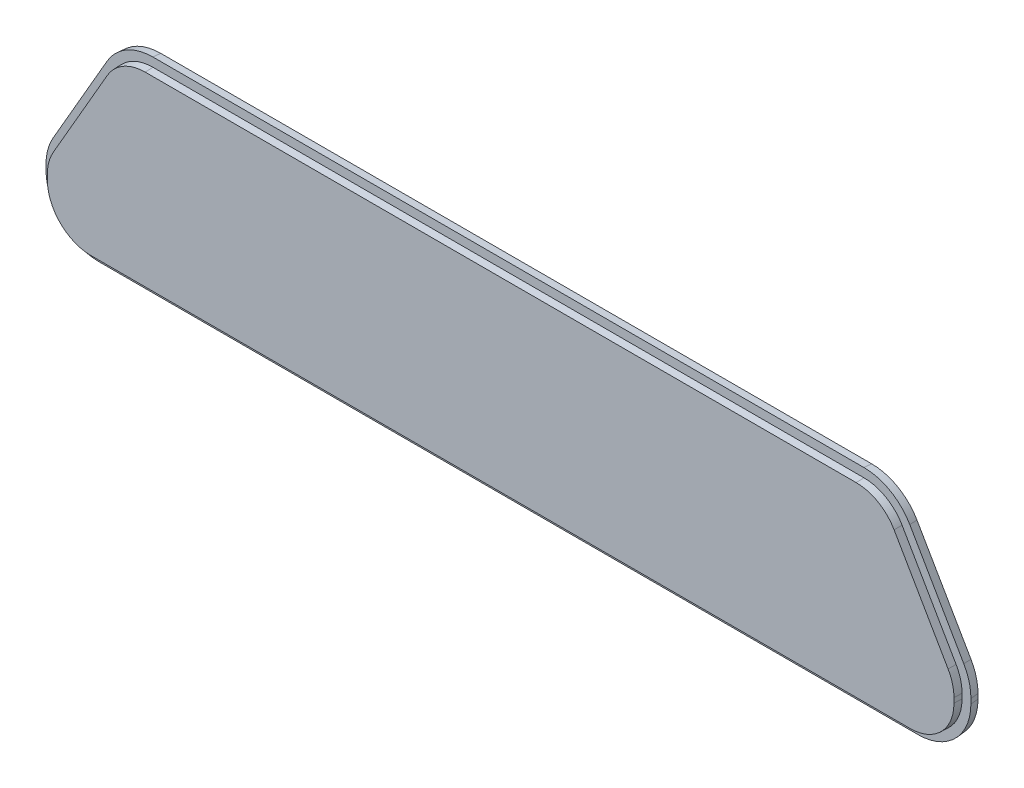
ISO-10303-21;
HEADER;
FILE_DESCRIPTION(('STEP AP214'),'2;1');
FILE_NAME('part.step','',(''),(''),'','','');
FILE_SCHEMA(('AUTOMOTIVE_DESIGN { 1 0 10303 214 1 1 1 1 }'));
ENDSEC;
DATA;
#1=APPLICATION_CONTEXT('core data for automotive mechanical design processes');
#2=APPLICATION_PROTOCOL_DEFINITION('international standard','automotive_design',2000,#1);
#3=PRODUCT_CONTEXT('',#1,'mechanical');
#4=PRODUCT('Part','Part','',(#3));
#5=PRODUCT_RELATED_PRODUCT_CATEGORY('part','',(#4));
#6=PRODUCT_DEFINITION_FORMATION('','',#4);
#7=PRODUCT_DEFINITION_CONTEXT('part definition',#1,'design');
#8=PRODUCT_DEFINITION('design','',#6,#7);
#9=PRODUCT_DEFINITION_SHAPE('','',#8);
#10=(LENGTH_UNIT() NAMED_UNIT(*) SI_UNIT(.MILLI.,.METRE.));
#11=(NAMED_UNIT(*) PLANE_ANGLE_UNIT() SI_UNIT($,.RADIAN.));
#12=(NAMED_UNIT(*) SI_UNIT($,.STERADIAN.) SOLID_ANGLE_UNIT());
#13=UNCERTAINTY_MEASURE_WITH_UNIT(LENGTH_MEASURE(1.E-05),#10,'distance_accuracy_value','');
#14=(GEOMETRIC_REPRESENTATION_CONTEXT(3) GLOBAL_UNCERTAINTY_ASSIGNED_CONTEXT((#13)) GLOBAL_UNIT_ASSIGNED_CONTEXT((#10,
#11,#12)) REPRESENTATION_CONTEXT('',''));
#15=CARTESIAN_POINT('',(0.,0.,0.));
#16=DIRECTION('',(0.,0.,1.));
#17=DIRECTION('',(1.,0.,0.));
#18=AXIS2_PLACEMENT_3D('',#15,#16,#17);
#19=CARTESIAN_POINT('',(-57.992183374922,24.6888,1.27));
#20=DIRECTION('',(0.,0.,1.));
#21=DIRECTION('',(1.,0.,0.));
#22=AXIS2_PLACEMENT_3D('',#19,#20,#21);
#23=PLANE('',#22);
#24=CARTESIAN_POINT('',(-57.992183374922,24.6888,1.27));
#25=DIRECTION('',(0.,0.,1.));
#26=DIRECTION('',(1.,0.,0.));
#27=AXIS2_PLACEMENT_3D('',#24,#25,#26);
#28=CIRCLE('',#27,7.14385062274547);
#29=CARTESIAN_POINT('',(-57.992183374922,31.8326506227455,1.27));
#30=VERTEX_POINT('',#29);
#31=CARTESIAN_POINT('',(-64.1789394950609,28.2607253113728,1.27));
#32=VERTEX_POINT('',#31);
#33=EDGE_CURVE('E267',#30,#32,#28,.T.);
#34=ORIENTED_EDGE('',*,*,#33,.T.);
#35=DIRECTION('',(-0.5,-0.866025403784438,0.));
#36=VECTOR('',#35,1.);
#37=CARTESIAN_POINT('',(-64.1789394950609,28.2607253113728,1.27));
#38=LINE('',#37,#36);
#39=CARTESIAN_POINT('',(-72.9887561201389,13.0016753113727,1.27));
#40=VERTEX_POINT('',#39);
#41=EDGE_CURVE('E257',#32,#40,#38,.T.);
#42=ORIENTED_EDGE('',*,*,#41,.T.);
#43=CARTESIAN_POINT('',(-66.802,9.42975,1.27));
#44=DIRECTION('',(0.,0.,1.));
#45=DIRECTION('',(1.,0.,0.));
#46=AXIS2_PLACEMENT_3D('',#43,#44,#45);
#47=CIRCLE('',#46,7.14385062274547);
#48=CARTESIAN_POINT('',(-73.9458506227455,9.42975,1.27));
#49=VERTEX_POINT('',#48);
#50=EDGE_CURVE('E251',#40,#49,#47,.T.);
#51=ORIENTED_EDGE('',*,*,#50,.T.);
#52=DIRECTION('',(0.,-1.,0.));
#53=VECTOR('',#52,1.);
#54=CARTESIAN_POINT('',(-73.9458506227455,9.42975,1.27));
#55=LINE('',#54,#53);
#56=CARTESIAN_POINT('',(-73.9458506227455,8.636,1.27));
#57=VERTEX_POINT('',#56);
#58=EDGE_CURVE('E250',#49,#57,#55,.T.);
#59=ORIENTED_EDGE('',*,*,#58,.T.);
#60=CARTESIAN_POINT('',(-66.802,8.636,1.27));
#61=DIRECTION('',(0.,0.,1.));
#62=DIRECTION('',(1.,0.,0.));
#63=AXIS2_PLACEMENT_3D('',#60,#61,#62);
#64=CIRCLE('',#63,7.14385062274549);
#65=CARTESIAN_POINT('',(-66.802,1.49214937725451,1.27));
#66=VERTEX_POINT('',#65);
#67=EDGE_CURVE('E242',#57,#66,#64,.T.);
#68=ORIENTED_EDGE('',*,*,#67,.T.);
#69=DIRECTION('',(1.,0.,0.));
#70=VECTOR('',#69,1.);
#71=CARTESIAN_POINT('',(-66.802,1.49214937725451,1.27));
#72=LINE('',#71,#70);
#73=CARTESIAN_POINT('',(66.802,1.49214937725452,1.27));
#74=VERTEX_POINT('',#73);
#75=EDGE_CURVE('E300',#66,#74,#72,.T.);
#76=ORIENTED_EDGE('',*,*,#75,.T.);
#77=CARTESIAN_POINT('',(66.802,8.636,1.27));
#78=DIRECTION('',(0.,0.,1.));
#79=DIRECTION('',(1.,0.,0.));
#80=AXIS2_PLACEMENT_3D('',#77,#78,#79);
#81=CIRCLE('',#80,7.14385062274549);
#82=CARTESIAN_POINT('',(73.9458506227455,8.636,1.27));
#83=VERTEX_POINT('',#82);
#84=EDGE_CURVE('E241',#74,#83,#81,.T.);
#85=ORIENTED_EDGE('',*,*,#84,.T.);
#86=DIRECTION('',(0.,1.,0.));
#87=VECTOR('',#86,1.);
#88=CARTESIAN_POINT('',(73.9458506227455,8.636,1.27));
#89=LINE('',#88,#87);
#90=CARTESIAN_POINT('',(73.9458506227455,9.42975,1.27));
#91=VERTEX_POINT('',#90);
#92=EDGE_CURVE('E221',#83,#91,#89,.T.);
#93=ORIENTED_EDGE('',*,*,#92,.T.);
#94=CARTESIAN_POINT('',(66.802,9.42975,1.27));
#95=DIRECTION('',(0.,0.,1.));
#96=DIRECTION('',(1.,0.,0.));
#97=AXIS2_PLACEMENT_3D('',#94,#95,#96);
#98=CIRCLE('',#97,7.14385062274549);
#99=CARTESIAN_POINT('',(72.9887561201389,13.0016753113728,1.27));
#100=VERTEX_POINT('',#99);
#101=EDGE_CURVE('E218',#91,#100,#98,.T.);
#102=ORIENTED_EDGE('',*,*,#101,.T.);
#103=DIRECTION('',(-0.5,0.866025403784438,0.));
#104=VECTOR('',#103,1.);
#105=CARTESIAN_POINT('',(72.9887561201389,13.0016753113728,1.27));
#106=LINE('',#105,#104);
#107=CARTESIAN_POINT('',(64.1789394950609,28.2607253113728,1.27));
#108=VERTEX_POINT('',#107);
#109=EDGE_CURVE('E206',#100,#108,#106,.T.);
#110=ORIENTED_EDGE('',*,*,#109,.T.);
#111=CARTESIAN_POINT('',(57.992183374922,24.6888,1.27));
#112=DIRECTION('',(0.,0.,1.));
#113=DIRECTION('',(1.,0.,0.));
#114=AXIS2_PLACEMENT_3D('',#111,#112,#113);
#115=CIRCLE('',#114,7.14385062274546);
#116=CARTESIAN_POINT('',(57.992183374922,31.8326506227455,1.27));
#117=VERTEX_POINT('',#116);
#118=EDGE_CURVE('E26',#108,#117,#115,.T.);
#119=ORIENTED_EDGE('',*,*,#118,.T.);
#120=DIRECTION('',(-1.,0.,0.));
#121=VECTOR('',#120,1.);
#122=CARTESIAN_POINT('',(57.992183374922,31.8326506227455,1.27));
#123=LINE('',#122,#121);
#124=EDGE_CURVE('E11',#117,#30,#123,.T.);
#125=ORIENTED_EDGE('',*,*,#124,.T.);
#126=EDGE_LOOP('',(#34,#42,#51,#59,#68,#76,#85,#93,#102,#110,#119,#125));
#127=FACE_BOUND('',#126,.T.);
#128=ADVANCED_FACE('F17',(#127),#23,.T.);
#129=CARTESIAN_POINT('',(57.992183374922,31.877,0.));
#130=DIRECTION('',(0.,0.999390827019096,0.034899496702501));
#131=DIRECTION('',(1.,0.,0.));
#132=AXIS2_PLACEMENT_3D('',#129,#130,#131);
#133=PLANE('',#132);
#134=DIRECTION('',(-1.,0.,0.));
#135=VECTOR('',#134,1.);
#136=CARTESIAN_POINT('',(57.992183374922,31.877,0.));
#137=LINE('',#136,#135);
#138=CARTESIAN_POINT('',(57.992183374922,31.877,0.));
#139=VERTEX_POINT('',#138);
#140=CARTESIAN_POINT('',(-57.992183374922,31.877,0.));
#141=VERTEX_POINT('',#140);
#142=EDGE_CURVE('E382',#139,#141,#137,.T.);
#143=ORIENTED_EDGE('',*,*,#142,.T.);
#144=DIRECTION('',(0.,0.034899496702501,-0.999390827019096));
#145=VECTOR('',#144,1.);
#146=CARTESIAN_POINT('',(-57.992183374922,31.877,0.));
#147=LINE('',#146,#145);
#148=EDGE_CURVE('E264',#30,#141,#147,.T.);
#149=ORIENTED_EDGE('',*,*,#148,.F.);
#150=ORIENTED_EDGE('',*,*,#124,.F.);
#151=DIRECTION('',(0.,0.034899496702501,-0.999390827019096));
#152=VECTOR('',#151,1.);
#153=CARTESIAN_POINT('',(57.992183374922,31.877,0.));
#154=LINE('',#153,#152);
#155=EDGE_CURVE('E216',#117,#139,#154,.T.);
#156=ORIENTED_EDGE('',*,*,#155,.T.);
#157=EDGE_LOOP('',(#143,#149,#150,#156));
#158=FACE_BOUND('',#157,.T.);
#159=ADVANCED_FACE('F551',(#158),#133,.T.);
#160=CARTESIAN_POINT('',(57.992183374922,24.6888,0.));
#161=DIRECTION('',(0.,0.,-1.));
#162=DIRECTION('',(1.,0.,0.));
#163=AXIS2_PLACEMENT_3D('',#160,#161,#162);
#164=CONICAL_SURFACE('',#163,7.1882,0.0349065850398857);
#165=CARTESIAN_POINT('',(57.992183374922,24.6888,0.));
#166=DIRECTION('',(0.,0.,1.));
#167=DIRECTION('',(1.,0.,0.));
#168=AXIS2_PLACEMENT_3D('',#165,#166,#167);
#169=CIRCLE('',#168,7.1882);
#170=CARTESIAN_POINT('',(64.2173471824053,28.2829,0.));
#171=VERTEX_POINT('',#170);
#172=EDGE_CURVE('E386',#171,#139,#169,.T.);
#173=ORIENTED_EDGE('',*,*,#172,.T.);
#174=ORIENTED_EDGE('',*,*,#155,.F.);
#175=ORIENTED_EDGE('',*,*,#118,.F.);
#176=DIRECTION('',(0.0302238507236571,0.0174497483512506,-0.999390827019096));
#177=VECTOR('',#176,1.);
#178=CARTESIAN_POINT('',(64.2173471824053,28.2829,0.));
#179=LINE('',#178,#177);
#180=EDGE_CURVE('E213',#108,#171,#179,.T.);
#181=ORIENTED_EDGE('',*,*,#180,.T.);
#182=EDGE_LOOP('',(#173,#174,#175,#181));
#183=FACE_BOUND('',#182,.T.);
#184=ADVANCED_FACE('F558',(#183),#164,.T.);
#185=CARTESIAN_POINT('',(73.0271638074833,13.02385,0.));
#186=DIRECTION('',(0.865497844507675,0.49969541350955,0.034899496702501));
#187=DIRECTION('',(0.,0.0696718216761224,-0.997569966099787));
#188=AXIS2_PLACEMENT_3D('',#185,#186,#187);
#189=PLANE('',#188);
#190=DIRECTION('',(-0.5,0.866025403784438,0.));
#191=VECTOR('',#190,1.);
#192=CARTESIAN_POINT('',(73.0271638074833,13.02385,0.));
#193=LINE('',#192,#191);
#194=CARTESIAN_POINT('',(73.0271638074833,13.02385,0.));
#195=VERTEX_POINT('',#194);
#196=EDGE_CURVE('E379',#195,#171,#193,.T.);
#197=ORIENTED_EDGE('',*,*,#196,.T.);
#198=ORIENTED_EDGE('',*,*,#180,.F.);
#199=ORIENTED_EDGE('',*,*,#109,.F.);
#200=DIRECTION('',(0.0302238507236571,0.0174497483512506,-0.999390827019096));
#201=VECTOR('',#200,1.);
#202=CARTESIAN_POINT('',(73.0271638074833,13.02385,0.));
#203=LINE('',#202,#201);
#204=EDGE_CURVE('E211',#100,#195,#203,.T.);
#205=ORIENTED_EDGE('',*,*,#204,.T.);
#206=EDGE_LOOP('',(#197,#198,#199,#205));
#207=FACE_BOUND('',#206,.T.);
#208=ADVANCED_FACE('F209',(#207),#189,.T.);
#209=CARTESIAN_POINT('',(66.802,9.42975,0.));
#210=DIRECTION('',(0.,0.,-1.));
#211=DIRECTION('',(1.,0.,0.));
#212=AXIS2_PLACEMENT_3D('',#209,#210,#211);
#213=CONICAL_SURFACE('',#212,7.1882,0.0349065850398857);
#214=CARTESIAN_POINT('',(66.802,9.42975,0.));
#215=DIRECTION('',(0.,0.,1.));
#216=DIRECTION('',(1.,0.,0.));
#217=AXIS2_PLACEMENT_3D('',#214,#215,#216);
#218=CIRCLE('',#217,7.1882);
#219=CARTESIAN_POINT('',(73.9902,9.42975,0.));
#220=VERTEX_POINT('',#219);
#221=EDGE_CURVE('E228',#220,#195,#218,.T.);
#222=ORIENTED_EDGE('',*,*,#221,.T.);
#223=ORIENTED_EDGE('',*,*,#204,.F.);
#224=ORIENTED_EDGE('',*,*,#101,.F.);
#225=DIRECTION('',(0.034899496702501,0.,-0.999390827019096));
#226=VECTOR('',#225,1.);
#227=CARTESIAN_POINT('',(73.9902,9.42975,0.));
#228=LINE('',#227,#226);
#229=EDGE_CURVE('E236',#91,#220,#228,.T.);
#230=ORIENTED_EDGE('',*,*,#229,.T.);
#231=EDGE_LOOP('',(#222,#223,#224,#230));
#232=FACE_BOUND('',#231,.T.);
#233=ADVANCED_FACE('F226',(#232),#213,.T.);
#234=CARTESIAN_POINT('',(73.9902,8.636,0.));
#235=DIRECTION('',(0.999390827019096,0.,0.034899496702501));
#236=DIRECTION('',(0.,-1.,0.));
#237=AXIS2_PLACEMENT_3D('',#234,#235,#236);
#238=PLANE('',#237);
#239=DIRECTION('',(0.,1.,0.));
#240=VECTOR('',#239,1.);
#241=CARTESIAN_POINT('',(73.9902,8.636,0.));
#242=LINE('',#241,#240);
#243=CARTESIAN_POINT('',(73.9902,8.636,0.));
#244=VERTEX_POINT('',#243);
#245=EDGE_CURVE('E374',#244,#220,#242,.T.);
#246=ORIENTED_EDGE('',*,*,#245,.T.);
#247=ORIENTED_EDGE('',*,*,#229,.F.);
#248=ORIENTED_EDGE('',*,*,#92,.F.);
#249=DIRECTION('',(0.034899496702501,0.,-0.999390827019096));
#250=VECTOR('',#249,1.);
#251=CARTESIAN_POINT('',(73.9902,8.636,0.));
#252=LINE('',#251,#250);
#253=EDGE_CURVE('E270',#83,#244,#252,.T.);
#254=ORIENTED_EDGE('',*,*,#253,.T.);
#255=EDGE_LOOP('',(#246,#247,#248,#254));
#256=FACE_BOUND('',#255,.T.);
#257=ADVANCED_FACE('F580',(#256),#238,.T.);
#258=CARTESIAN_POINT('',(66.802,8.636,0.));
#259=DIRECTION('',(0.,0.,-1.));
#260=DIRECTION('',(1.,0.,0.));
#261=AXIS2_PLACEMENT_3D('',#258,#259,#260);
#262=CONICAL_SURFACE('',#261,7.1882,0.0349065850398857);
#263=CARTESIAN_POINT('',(66.802,8.636,0.));
#264=DIRECTION('',(0.,0.,1.));
#265=DIRECTION('',(1.,0.,0.));
#266=AXIS2_PLACEMENT_3D('',#263,#264,#265);
#267=CIRCLE('',#266,7.1882);
#268=CARTESIAN_POINT('',(66.802,1.4478,0.));
#269=VERTEX_POINT('',#268);
#270=EDGE_CURVE('E370',#269,#244,#267,.T.);
#271=ORIENTED_EDGE('',*,*,#270,.T.);
#272=ORIENTED_EDGE('',*,*,#253,.F.);
#273=ORIENTED_EDGE('',*,*,#84,.F.);
#274=DIRECTION('',(0.,-0.034899496702501,-0.999390827019096));
#275=VECTOR('',#274,1.);
#276=CARTESIAN_POINT('',(66.802,1.4478,0.));
#277=LINE('',#276,#275);
#278=EDGE_CURVE('E246',#74,#269,#277,.T.);
#279=ORIENTED_EDGE('',*,*,#278,.T.);
#280=EDGE_LOOP('',(#271,#272,#273,#279));
#281=FACE_BOUND('',#280,.T.);
#282=ADVANCED_FACE('F585',(#281),#262,.T.);
#283=CARTESIAN_POINT('',(-66.802,1.44779999999999,0.));
#284=DIRECTION('',(0.,-0.999390827019096,0.034899496702501));
#285=DIRECTION('',(-1.,0.,0.));
#286=AXIS2_PLACEMENT_3D('',#283,#284,#285);
#287=PLANE('',#286);
#288=DIRECTION('',(1.,0.,0.));
#289=VECTOR('',#288,1.);
#290=CARTESIAN_POINT('',(-66.802,1.44779999999999,0.));
#291=LINE('',#290,#289);
#292=CARTESIAN_POINT('',(-66.802,1.44779999999998,0.));
#293=VERTEX_POINT('',#292);
#294=EDGE_CURVE('E364',#293,#269,#291,.T.);
#295=ORIENTED_EDGE('',*,*,#294,.T.);
#296=ORIENTED_EDGE('',*,*,#278,.F.);
#297=ORIENTED_EDGE('',*,*,#75,.F.);
#298=DIRECTION('',(0.,-0.034899496702501,-0.999390827019096));
#299=VECTOR('',#298,1.);
#300=CARTESIAN_POINT('',(-66.802,1.44779999999999,0.));
#301=LINE('',#300,#299);
#302=EDGE_CURVE('E247',#66,#293,#301,.T.);
#303=ORIENTED_EDGE('',*,*,#302,.T.);
#304=EDGE_LOOP('',(#295,#296,#297,#303));
#305=FACE_BOUND('',#304,.T.);
#306=ADVANCED_FACE('F589',(#305),#287,.T.);
#307=CARTESIAN_POINT('',(-66.802,8.636,0.));
#308=DIRECTION('',(0.,0.,-1.));
#309=DIRECTION('',(1.,0.,0.));
#310=AXIS2_PLACEMENT_3D('',#307,#308,#309);
#311=CONICAL_SURFACE('',#310,7.1882,0.0349065850398857);
#312=CARTESIAN_POINT('',(-66.802,8.636,0.));
#313=DIRECTION('',(0.,0.,1.));
#314=DIRECTION('',(1.,0.,0.));
#315=AXIS2_PLACEMENT_3D('',#312,#313,#314);
#316=CIRCLE('',#315,7.1882);
#317=CARTESIAN_POINT('',(-73.9902,8.636,0.));
#318=VERTEX_POINT('',#317);
#319=EDGE_CURVE('E360',#318,#293,#316,.T.);
#320=ORIENTED_EDGE('',*,*,#319,.T.);
#321=ORIENTED_EDGE('',*,*,#302,.F.);
#322=ORIENTED_EDGE('',*,*,#67,.F.);
#323=DIRECTION('',(-0.034899496702501,0.,-0.999390827019096));
#324=VECTOR('',#323,1.);
#325=CARTESIAN_POINT('',(-73.9902,8.636,0.));
#326=LINE('',#325,#324);
#327=EDGE_CURVE('E255',#57,#318,#326,.T.);
#328=ORIENTED_EDGE('',*,*,#327,.T.);
#329=EDGE_LOOP('',(#320,#321,#322,#328));
#330=FACE_BOUND('',#329,.T.);
#331=ADVANCED_FACE('F598',(#330),#311,.T.);
#332=CARTESIAN_POINT('',(-73.9902,9.42975,0.));
#333=DIRECTION('',(-0.999390827019096,0.,0.034899496702501));
#334=DIRECTION('',(0.,1.,0.));
#335=AXIS2_PLACEMENT_3D('',#332,#333,#334);
#336=PLANE('',#335);
#337=DIRECTION('',(0.,-1.,0.));
#338=VECTOR('',#337,1.);
#339=CARTESIAN_POINT('',(-73.9902,9.42975,0.));
#340=LINE('',#339,#338);
#341=CARTESIAN_POINT('',(-73.9902,9.42975,0.));
#342=VERTEX_POINT('',#341);
#343=EDGE_CURVE('E356',#342,#318,#340,.T.);
#344=ORIENTED_EDGE('',*,*,#343,.T.);
#345=ORIENTED_EDGE('',*,*,#327,.F.);
#346=ORIENTED_EDGE('',*,*,#58,.F.);
#347=DIRECTION('',(-0.034899496702501,0.,-0.999390827019096));
#348=VECTOR('',#347,1.);
#349=CARTESIAN_POINT('',(-73.9902,9.42975,0.));
#350=LINE('',#349,#348);
#351=EDGE_CURVE('E256',#49,#342,#350,.T.);
#352=ORIENTED_EDGE('',*,*,#351,.T.);
#353=EDGE_LOOP('',(#344,#345,#346,#352));
#354=FACE_BOUND('',#353,.T.);
#355=ADVANCED_FACE('F607',(#354),#336,.T.);
#356=CARTESIAN_POINT('',(-66.802,9.42975,0.));
#357=DIRECTION('',(0.,0.,-1.));
#358=DIRECTION('',(1.,0.,0.));
#359=AXIS2_PLACEMENT_3D('',#356,#357,#358);
#360=CONICAL_SURFACE('',#359,7.1882,0.0349065850398857);
#361=CARTESIAN_POINT('',(-66.802,9.42975,0.));
#362=DIRECTION('',(0.,0.,1.));
#363=DIRECTION('',(1.,0.,0.));
#364=AXIS2_PLACEMENT_3D('',#361,#362,#363);
#365=CIRCLE('',#364,7.1882);
#366=CARTESIAN_POINT('',(-73.0271638074833,13.02385,0.));
#367=VERTEX_POINT('',#366);
#368=EDGE_CURVE('E348',#367,#342,#365,.T.);
#369=ORIENTED_EDGE('',*,*,#368,.T.);
#370=ORIENTED_EDGE('',*,*,#351,.F.);
#371=ORIENTED_EDGE('',*,*,#50,.F.);
#372=DIRECTION('',(-0.0302238507236571,0.0174497483512506,-0.999390827019096));
#373=VECTOR('',#372,1.);
#374=CARTESIAN_POINT('',(-73.0271638074833,13.02385,0.));
#375=LINE('',#374,#373);
#376=EDGE_CURVE('E261',#40,#367,#375,.T.);
#377=ORIENTED_EDGE('',*,*,#376,.T.);
#378=EDGE_LOOP('',(#369,#370,#371,#377));
#379=FACE_BOUND('',#378,.T.);
#380=ADVANCED_FACE('F613',(#379),#360,.T.);
#381=CARTESIAN_POINT('',(-64.2173471824053,28.2829,0.));
#382=DIRECTION('',(-0.865497844507676,0.499695413509549,0.034899496702501));
#383=DIRECTION('',(0.0402902897014407,0.,0.999188016619382));
#384=AXIS2_PLACEMENT_3D('',#381,#382,#383);
#385=PLANE('',#384);
#386=DIRECTION('',(-0.5,-0.866025403784438,0.));
#387=VECTOR('',#386,1.);
#388=CARTESIAN_POINT('',(-64.2173471824053,28.2829,0.));
#389=LINE('',#388,#387);
#390=CARTESIAN_POINT('',(-64.2173471824053,28.2829,0.));
#391=VERTEX_POINT('',#390);
#392=EDGE_CURVE('E344',#391,#367,#389,.T.);
#393=ORIENTED_EDGE('',*,*,#392,.T.);
#394=ORIENTED_EDGE('',*,*,#376,.F.);
#395=ORIENTED_EDGE('',*,*,#41,.F.);
#396=DIRECTION('',(-0.0302238507236571,0.0174497483512505,-0.999390827019096));
#397=VECTOR('',#396,1.);
#398=CARTESIAN_POINT('',(-64.2173471824053,28.2829,0.));
#399=LINE('',#398,#397);
#400=EDGE_CURVE('E273',#32,#391,#399,.T.);
#401=ORIENTED_EDGE('',*,*,#400,.T.);
#402=EDGE_LOOP('',(#393,#394,#395,#401));
#403=FACE_BOUND('',#402,.T.);
#404=ADVANCED_FACE('F617',(#403),#385,.T.);
#405=CARTESIAN_POINT('',(-57.992183374922,24.6888,0.));
#406=DIRECTION('',(0.,0.,-1.));
#407=DIRECTION('',(1.,0.,0.));
#408=AXIS2_PLACEMENT_3D('',#405,#406,#407);
#409=CONICAL_SURFACE('',#408,7.1882,0.0349065850398857);
#410=CARTESIAN_POINT('',(-57.992183374922,24.6888,0.));
#411=DIRECTION('',(0.,0.,1.));
#412=DIRECTION('',(1.,0.,0.));
#413=AXIS2_PLACEMENT_3D('',#410,#411,#412);
#414=CIRCLE('',#413,7.1882);
#415=EDGE_CURVE('E387',#141,#391,#414,.T.);
#416=ORIENTED_EDGE('',*,*,#415,.T.);
#417=ORIENTED_EDGE('',*,*,#400,.F.);
#418=ORIENTED_EDGE('',*,*,#33,.F.);
#419=ORIENTED_EDGE('',*,*,#148,.T.);
#420=EDGE_LOOP('',(#416,#417,#418,#419));
#421=FACE_BOUND('',#420,.T.);
#422=ADVANCED_FACE('F634',(#421),#409,.T.);
#423=CARTESIAN_POINT('',(-57.992183374922,24.6888,-1.27));
#424=DIRECTION('',(0.,0.,-1.));
#425=DIRECTION('',(0.,-1.,0.));
#426=AXIS2_PLACEMENT_3D('',#423,#424,#425);
#427=PLANE('',#426);
#428=CARTESIAN_POINT('',(-57.992183374922,24.6888,-1.27));
#429=DIRECTION('',(0.,0.,1.));
#430=DIRECTION('',(-1.,0.,0.));
#431=AXIS2_PLACEMENT_3D('',#428,#429,#430);
#432=CIRCLE('',#431,8.52488939732207);
#433=CARTESIAN_POINT('',(-57.992183374922,33.2136893973221,-1.27));
#434=VERTEX_POINT('',#433);
#435=CARTESIAN_POINT('',(-65.3749541574555,28.951244698661,-1.27));
#436=VERTEX_POINT('',#435);
#437=EDGE_CURVE('E330',#434,#436,#432,.T.);
#438=ORIENTED_EDGE('',*,*,#437,.F.);
#439=DIRECTION('',(-1.,0.,0.));
#440=VECTOR('',#439,1.);
#441=CARTESIAN_POINT('',(57.992183374922,33.2136893973221,-1.27));
#442=LINE('',#441,#440);
#443=CARTESIAN_POINT('',(57.992183374922,33.2136893973221,-1.27));
#444=VERTEX_POINT('',#443);
#445=EDGE_CURVE('E322',#444,#434,#442,.T.);
#446=ORIENTED_EDGE('',*,*,#445,.F.);
#447=CARTESIAN_POINT('',(57.992183374922,24.6888,-1.27));
#448=DIRECTION('',(0.,0.,1.));
#449=DIRECTION('',(-1.,0.,0.));
#450=AXIS2_PLACEMENT_3D('',#447,#448,#449);
#451=CIRCLE('',#450,8.52488939732207);
#452=CARTESIAN_POINT('',(65.3749541574555,28.951244698661,-1.27));
#453=VERTEX_POINT('',#452);
#454=EDGE_CURVE('E316',#453,#444,#451,.T.);
#455=ORIENTED_EDGE('',*,*,#454,.F.);
#456=DIRECTION('',(-0.5,0.866025403784438,0.));
#457=VECTOR('',#456,1.);
#458=CARTESIAN_POINT('',(74.1847707825335,13.6921946986611,-1.27));
#459=LINE('',#458,#457);
#460=CARTESIAN_POINT('',(74.1847707825335,13.6921946986611,-1.27));
#461=VERTEX_POINT('',#460);
#462=EDGE_CURVE('E315',#461,#453,#459,.T.);
#463=ORIENTED_EDGE('',*,*,#462,.F.);
#464=CARTESIAN_POINT('',(66.802,9.42975,-1.27));
#465=DIRECTION('',(0.,0.,1.));
#466=DIRECTION('',(-1.,0.,0.));
#467=AXIS2_PLACEMENT_3D('',#464,#465,#466);
#468=CIRCLE('',#467,8.52488939732208);
#469=CARTESIAN_POINT('',(75.3268893973221,9.42975,-1.27));
#470=VERTEX_POINT('',#469);
#471=EDGE_CURVE('E307',#470,#461,#468,.T.);
#472=ORIENTED_EDGE('',*,*,#471,.F.);
#473=DIRECTION('',(0.,1.,0.));
#474=VECTOR('',#473,1.);
#475=CARTESIAN_POINT('',(75.3268893973221,9.42975,-1.27));
#476=LINE('',#475,#474);
#477=CARTESIAN_POINT('',(75.3268893973221,8.636,-1.27));
#478=VERTEX_POINT('',#477);
#479=EDGE_CURVE('E299',#478,#470,#476,.T.);
#480=ORIENTED_EDGE('',*,*,#479,.F.);
#481=CARTESIAN_POINT('',(66.802,8.636,-1.27));
#482=DIRECTION('',(0.,0.,1.));
#483=DIRECTION('',(-1.,0.,0.));
#484=AXIS2_PLACEMENT_3D('',#481,#482,#483);
#485=CIRCLE('',#484,8.52488939732208);
#486=CARTESIAN_POINT('',(66.802,0.111110602677924,-1.27));
#487=VERTEX_POINT('',#486);
#488=EDGE_CURVE('E293',#487,#478,#485,.T.);
#489=ORIENTED_EDGE('',*,*,#488,.F.);
#490=DIRECTION('',(1.,0.,0.));
#491=VECTOR('',#490,1.);
#492=CARTESIAN_POINT('',(-66.802,0.111110602677924,-1.27));
#493=LINE('',#492,#491);
#494=CARTESIAN_POINT('',(-66.802,0.111110602677915,-1.27));
#495=VERTEX_POINT('',#494);
#496=EDGE_CURVE('E281',#495,#487,#493,.T.);
#497=ORIENTED_EDGE('',*,*,#496,.F.);
#498=CARTESIAN_POINT('',(-66.802,8.636,-1.27));
#499=DIRECTION('',(0.,0.,1.));
#500=DIRECTION('',(-1.,0.,0.));
#501=AXIS2_PLACEMENT_3D('',#498,#499,#500);
#502=CIRCLE('',#501,8.52488939732209);
#503=CARTESIAN_POINT('',(-75.3268893973221,8.636,-1.27));
#504=VERTEX_POINT('',#503);
#505=EDGE_CURVE('E286',#504,#495,#502,.T.);
#506=ORIENTED_EDGE('',*,*,#505,.F.);
#507=DIRECTION('',(0.,-1.,0.));
#508=VECTOR('',#507,1.);
#509=CARTESIAN_POINT('',(-75.3268893973221,9.42975,-1.27));
#510=LINE('',#509,#508);
#511=CARTESIAN_POINT('',(-75.3268893973221,9.42975,-1.27));
#512=VERTEX_POINT('',#511);
#513=EDGE_CURVE('E334',#512,#504,#510,.T.);
#514=ORIENTED_EDGE('',*,*,#513,.F.);
#515=CARTESIAN_POINT('',(-66.802,9.42975,-1.27));
#516=DIRECTION('',(0.,0.,1.));
#517=DIRECTION('',(-1.,0.,0.));
#518=AXIS2_PLACEMENT_3D('',#515,#516,#517);
#519=CIRCLE('',#518,8.52488939732209);
#520=CARTESIAN_POINT('',(-74.1847707825335,13.692194698661,-1.27));
#521=VERTEX_POINT('',#520);
#522=EDGE_CURVE('E277',#521,#512,#519,.T.);
#523=ORIENTED_EDGE('',*,*,#522,.F.);
#524=DIRECTION('',(-0.5,-0.866025403784438,0.));
#525=VECTOR('',#524,1.);
#526=CARTESIAN_POINT('',(-65.3749541574555,28.951244698661,-1.27));
#527=LINE('',#526,#525);
#528=EDGE_CURVE('E274',#436,#521,#527,.T.);
#529=ORIENTED_EDGE('',*,*,#528,.F.);
#530=EDGE_LOOP('',(#438,#446,#455,#463,#472,#480,#489,#497,#506,#514,#523,#529));
#531=FACE_BOUND('',#530,.T.);
#532=ADVANCED_FACE('F519',(#531),#427,.T.);
#533=CARTESIAN_POINT('',(-65.4711787620044,29.0068,0.));
#534=DIRECTION('',(-0.86272991566282,0.498097349045875,-0.0871557427476584));
#535=DIRECTION('',(-0.100511613750393,0.,0.994935885120892));
#536=AXIS2_PLACEMENT_3D('',#533,#534,#535);
#537=PLANE('',#536);
#538=DIRECTION('',(-0.5,-0.866025403784438,0.));
#539=VECTOR('',#538,1.);
#540=CARTESIAN_POINT('',(-65.4711787620044,29.0068,0.));
#541=LINE('',#540,#539);
#542=CARTESIAN_POINT('',(-65.4711787620044,29.0068,0.));
#543=VERTEX_POINT('',#542);
#544=CARTESIAN_POINT('',(-74.2809953870824,13.74775,0.));
#545=VERTEX_POINT('',#544);
#546=EDGE_CURVE('E450',#543,#545,#541,.T.);
#547=ORIENTED_EDGE('',*,*,#546,.F.);
#548=DIRECTION('',(-0.0754790873051734,0.0435778713738294,0.996194698091746));
#549=VECTOR('',#548,1.);
#550=CARTESIAN_POINT('',(-65.4711787620044,29.0068,0.));
#551=LINE('',#550,#549);
#552=EDGE_CURVE('E326',#436,#543,#551,.T.);
#553=ORIENTED_EDGE('',*,*,#552,.F.);
#554=ORIENTED_EDGE('',*,*,#528,.T.);
#555=DIRECTION('',(-0.0754790873051734,0.0435778713738294,0.996194698091746));
#556=VECTOR('',#555,1.);
#557=CARTESIAN_POINT('',(-74.2809953870824,13.74775,0.));
#558=LINE('',#557,#556);
#559=EDGE_CURVE('E280',#521,#545,#558,.T.);
#560=ORIENTED_EDGE('',*,*,#559,.T.);
#561=EDGE_LOOP('',(#547,#553,#554,#560));
#562=FACE_BOUND('',#561,.T.);
#563=ADVANCED_FACE('F643',(#562),#537,.T.);
#564=CARTESIAN_POINT('',(-66.802,9.42975,0.));
#565=DIRECTION('',(0.,0.,1.));
#566=DIRECTION('',(1.,0.,0.));
#567=AXIS2_PLACEMENT_3D('',#564,#565,#566);
#568=CONICAL_SURFACE('',#567,8.636,0.0872664625997163);
#569=CARTESIAN_POINT('',(-66.802,9.42975,0.));
#570=DIRECTION('',(0.,0.,1.));
#571=DIRECTION('',(1.,0.,0.));
#572=AXIS2_PLACEMENT_3D('',#569,#570,#571);
#573=CIRCLE('',#572,8.636);
#574=CARTESIAN_POINT('',(-75.438,9.42975,0.));
#575=VERTEX_POINT('',#574);
#576=EDGE_CURVE('E441',#545,#575,#573,.T.);
#577=ORIENTED_EDGE('',*,*,#576,.F.);
#578=ORIENTED_EDGE('',*,*,#559,.F.);
#579=ORIENTED_EDGE('',*,*,#522,.T.);
#580=DIRECTION('',(-0.0871557427476584,0.,0.996194698091746));
#581=VECTOR('',#580,1.);
#582=CARTESIAN_POINT('',(-75.438,9.42975,0.));
#583=LINE('',#582,#581);
#584=EDGE_CURVE('E289',#512,#575,#583,.T.);
#585=ORIENTED_EDGE('',*,*,#584,.T.);
#586=EDGE_LOOP('',(#577,#578,#579,#585));
#587=FACE_BOUND('',#586,.T.);
#588=ADVANCED_FACE('F648',(#587),#568,.T.);
#589=CARTESIAN_POINT('',(-75.438,9.42975,0.));
#590=DIRECTION('',(-0.996194698091746,0.,-0.0871557427476584));
#591=DIRECTION('',(-0.0871557427476584,0.,0.996194698091746));
#592=AXIS2_PLACEMENT_3D('',#589,#590,#591);
#593=PLANE('',#592);
#594=DIRECTION('',(0.,-1.,0.));
#595=VECTOR('',#594,1.);
#596=CARTESIAN_POINT('',(-75.438,9.42975,0.));
#597=LINE('',#596,#595);
#598=CARTESIAN_POINT('',(-75.438,8.636,0.));
#599=VERTEX_POINT('',#598);
#600=EDGE_CURVE('E435',#575,#599,#597,.T.);
#601=ORIENTED_EDGE('',*,*,#600,.F.);
#602=ORIENTED_EDGE('',*,*,#584,.F.);
#603=ORIENTED_EDGE('',*,*,#513,.T.);
#604=DIRECTION('',(-0.0871557427476584,0.,0.996194698091746));
#605=VECTOR('',#604,1.);
#606=CARTESIAN_POINT('',(-75.438,8.636,0.));
#607=LINE('',#606,#605);
#608=EDGE_CURVE('E284',#504,#599,#607,.T.);
#609=ORIENTED_EDGE('',*,*,#608,.T.);
#610=EDGE_LOOP('',(#601,#602,#603,#609));
#611=FACE_BOUND('',#610,.T.);
#612=ADVANCED_FACE('F652',(#611),#593,.T.);
#613=CARTESIAN_POINT('',(-66.802,8.636,0.));
#614=DIRECTION('',(0.,0.,1.));
#615=DIRECTION('',(-1.,0.,0.));
#616=AXIS2_PLACEMENT_3D('',#613,#614,#615);
#617=CONICAL_SURFACE('',#616,8.636,0.0872664625997163);
#618=CARTESIAN_POINT('',(-66.802,8.636,0.));
#619=DIRECTION('',(0.,0.,1.));
#620=DIRECTION('',(-1.,0.,0.));
#621=AXIS2_PLACEMENT_3D('',#618,#619,#620);
#622=CIRCLE('',#621,8.636);
#623=CARTESIAN_POINT('',(-66.802,0.,0.));
#624=VERTEX_POINT('',#623);
#625=EDGE_CURVE('E431',#599,#624,#622,.T.);
#626=ORIENTED_EDGE('',*,*,#625,.F.);
#627=ORIENTED_EDGE('',*,*,#608,.F.);
#628=ORIENTED_EDGE('',*,*,#505,.T.);
#629=DIRECTION('',(0.,-0.0871557427476584,0.996194698091746));
#630=VECTOR('',#629,1.);
#631=CARTESIAN_POINT('',(-66.802,0.,0.));
#632=LINE('',#631,#630);
#633=EDGE_CURVE('E285',#495,#624,#632,.T.);
#634=ORIENTED_EDGE('',*,*,#633,.T.);
#635=EDGE_LOOP('',(#626,#627,#628,#634));
#636=FACE_BOUND('',#635,.T.);
#637=ADVANCED_FACE('F658',(#636),#617,.T.);
#638=CARTESIAN_POINT('',(-66.802,0.,0.));
#639=DIRECTION('',(0.,-0.996194698091746,-0.0871557427476584));
#640=DIRECTION('',(0.,0.0871557427476584,-0.996194698091746));
#641=AXIS2_PLACEMENT_3D('',#638,#639,#640);
#642=PLANE('',#641);
#643=DIRECTION('',(1.,0.,0.));
#644=VECTOR('',#643,1.);
#645=CARTESIAN_POINT('',(-66.802,0.,0.));
#646=LINE('',#645,#644);
#647=CARTESIAN_POINT('',(66.802,0.,0.));
#648=VERTEX_POINT('',#647);
#649=EDGE_CURVE('E422',#624,#648,#646,.T.);
#650=ORIENTED_EDGE('',*,*,#649,.F.);
#651=ORIENTED_EDGE('',*,*,#633,.F.);
#652=ORIENTED_EDGE('',*,*,#496,.T.);
#653=DIRECTION('',(0.,-0.0871557427476584,0.996194698091746));
#654=VECTOR('',#653,1.);
#655=CARTESIAN_POINT('',(66.802,0.,0.));
#656=LINE('',#655,#654);
#657=EDGE_CURVE('E296',#487,#648,#656,.T.);
#658=ORIENTED_EDGE('',*,*,#657,.T.);
#659=EDGE_LOOP('',(#650,#651,#652,#658));
#660=FACE_BOUND('',#659,.T.);
#661=ADVANCED_FACE('F662',(#660),#642,.T.);
#662=CARTESIAN_POINT('',(66.802,8.636,0.));
#663=DIRECTION('',(0.,0.,1.));
#664=DIRECTION('',(1.,0.,0.));
#665=AXIS2_PLACEMENT_3D('',#662,#663,#664);
#666=CONICAL_SURFACE('',#665,8.636,0.0872664625997163);
#667=CARTESIAN_POINT('',(66.802,8.636,0.));
#668=DIRECTION('',(0.,0.,1.));
#669=DIRECTION('',(1.,0.,0.));
#670=AXIS2_PLACEMENT_3D('',#667,#668,#669);
#671=CIRCLE('',#670,8.636);
#672=CARTESIAN_POINT('',(75.438,8.636,0.));
#673=VERTEX_POINT('',#672);
#674=EDGE_CURVE('E418',#648,#673,#671,.T.);
#675=ORIENTED_EDGE('',*,*,#674,.F.);
#676=ORIENTED_EDGE('',*,*,#657,.F.);
#677=ORIENTED_EDGE('',*,*,#488,.T.);
#678=DIRECTION('',(0.0871557427476584,0.,0.996194698091746));
#679=VECTOR('',#678,1.);
#680=CARTESIAN_POINT('',(75.438,8.636,0.));
#681=LINE('',#680,#679);
#682=EDGE_CURVE('E304',#478,#673,#681,.T.);
#683=ORIENTED_EDGE('',*,*,#682,.T.);
#684=EDGE_LOOP('',(#675,#676,#677,#683));
#685=FACE_BOUND('',#684,.T.);
#686=ADVANCED_FACE('F671',(#685),#666,.T.);
#687=CARTESIAN_POINT('',(75.438,9.42975,0.));
#688=DIRECTION('',(0.996194698091746,0.,-0.0871557427476584));
#689=DIRECTION('',(0.,-1.,0.));
#690=AXIS2_PLACEMENT_3D('',#687,#688,#689);
#691=PLANE('',#690);
#692=DIRECTION('',(0.,1.,0.));
#693=VECTOR('',#692,1.);
#694=CARTESIAN_POINT('',(75.438,9.42975,0.));
#695=LINE('',#694,#693);
#696=CARTESIAN_POINT('',(75.438,9.42975,0.));
#697=VERTEX_POINT('',#696);
#698=EDGE_CURVE('E414',#673,#697,#695,.T.);
#699=ORIENTED_EDGE('',*,*,#698,.F.);
#700=ORIENTED_EDGE('',*,*,#682,.F.);
#701=ORIENTED_EDGE('',*,*,#479,.T.);
#702=DIRECTION('',(0.0871557427476584,0.,0.996194698091746));
#703=VECTOR('',#702,1.);
#704=CARTESIAN_POINT('',(75.438,9.42975,0.));
#705=LINE('',#704,#703);
#706=EDGE_CURVE('E310',#470,#697,#705,.T.);
#707=ORIENTED_EDGE('',*,*,#706,.T.);
#708=EDGE_LOOP('',(#699,#700,#701,#707));
#709=FACE_BOUND('',#708,.T.);
#710=ADVANCED_FACE('F514',(#709),#691,.T.);
#711=CARTESIAN_POINT('',(66.802,9.42975,0.));
#712=DIRECTION('',(0.,0.,1.));
#713=DIRECTION('',(1.,0.,0.));
#714=AXIS2_PLACEMENT_3D('',#711,#712,#713);
#715=CONICAL_SURFACE('',#714,8.636,0.0872664625997163);
#716=CARTESIAN_POINT('',(66.802,9.42975,0.));
#717=DIRECTION('',(0.,0.,1.));
#718=DIRECTION('',(1.,0.,0.));
#719=AXIS2_PLACEMENT_3D('',#716,#717,#718);
#720=CIRCLE('',#719,8.636);
#721=CARTESIAN_POINT('',(74.2809953870824,13.74775,0.));
#722=VERTEX_POINT('',#721);
#723=EDGE_CURVE('E409',#697,#722,#720,.T.);
#724=ORIENTED_EDGE('',*,*,#723,.F.);
#725=ORIENTED_EDGE('',*,*,#706,.F.);
#726=ORIENTED_EDGE('',*,*,#471,.T.);
#727=DIRECTION('',(0.0754790873051734,0.0435778713738295,0.996194698091746));
#728=VECTOR('',#727,1.);
#729=CARTESIAN_POINT('',(74.2809953870824,13.74775,0.));
#730=LINE('',#729,#728);
#731=EDGE_CURVE('E311',#461,#722,#730,.T.);
#732=ORIENTED_EDGE('',*,*,#731,.T.);
#733=EDGE_LOOP('',(#724,#725,#726,#732));
#734=FACE_BOUND('',#733,.T.);
#735=ADVANCED_FACE('F502',(#734),#715,.T.);
#736=CARTESIAN_POINT('',(74.2809953870824,13.74775,0.));
#737=DIRECTION('',(0.86272991566282,0.498097349045875,-0.0871557427476584));
#738=DIRECTION('',(0.,-0.17235866172321,-0.985034259165124));
#739=AXIS2_PLACEMENT_3D('',#736,#737,#738);
#740=PLANE('',#739);
#741=DIRECTION('',(-0.5,0.866025403784438,0.));
#742=VECTOR('',#741,1.);
#743=CARTESIAN_POINT('',(74.2809953870824,13.74775,0.));
#744=LINE('',#743,#742);
#745=CARTESIAN_POINT('',(65.4711787620044,29.0068,0.));
#746=VERTEX_POINT('',#745);
#747=EDGE_CURVE('E413',#722,#746,#744,.T.);
#748=ORIENTED_EDGE('',*,*,#747,.F.);
#749=ORIENTED_EDGE('',*,*,#731,.F.);
#750=ORIENTED_EDGE('',*,*,#462,.T.);
#751=DIRECTION('',(0.0754790873051734,0.0435778713738294,0.996194698091746));
#752=VECTOR('',#751,1.);
#753=CARTESIAN_POINT('',(65.4711787620044,29.0068,0.));
#754=LINE('',#753,#752);
#755=EDGE_CURVE('E321',#453,#746,#754,.T.);
#756=ORIENTED_EDGE('',*,*,#755,.T.);
#757=EDGE_LOOP('',(#748,#749,#750,#756));
#758=FACE_BOUND('',#757,.T.);
#759=ADVANCED_FACE('F507',(#758),#740,.T.);
#760=CARTESIAN_POINT('',(57.992183374922,24.6888,0.));
#761=DIRECTION('',(0.,0.,1.));
#762=DIRECTION('',(1.,0.,0.));
#763=AXIS2_PLACEMENT_3D('',#760,#761,#762);
#764=CONICAL_SURFACE('',#763,8.636,0.0872664625997163);
#765=CARTESIAN_POINT('',(57.992183374922,24.6888,0.));
#766=DIRECTION('',(0.,0.,1.));
#767=DIRECTION('',(1.,0.,0.));
#768=AXIS2_PLACEMENT_3D('',#765,#766,#767);
#769=CIRCLE('',#768,8.636);
#770=CARTESIAN_POINT('',(57.992183374922,33.3248,0.));
#771=VERTEX_POINT('',#770);
#772=EDGE_CURVE('E405',#746,#771,#769,.T.);
#773=ORIENTED_EDGE('',*,*,#772,.F.);
#774=ORIENTED_EDGE('',*,*,#755,.F.);
#775=ORIENTED_EDGE('',*,*,#454,.T.);
#776=DIRECTION('',(0.,0.0871557427476584,0.996194698091746));
#777=VECTOR('',#776,1.);
#778=CARTESIAN_POINT('',(57.992183374922,33.3248,0.));
#779=LINE('',#778,#777);
#780=EDGE_CURVE('E325',#444,#771,#779,.T.);
#781=ORIENTED_EDGE('',*,*,#780,.T.);
#782=EDGE_LOOP('',(#773,#774,#775,#781));
#783=FACE_BOUND('',#782,.T.);
#784=ADVANCED_FACE('F524',(#783),#764,.T.);
#785=CARTESIAN_POINT('',(57.992183374922,33.3248,0.));
#786=DIRECTION('',(0.,0.996194698091746,-0.0871557427476584));
#787=DIRECTION('',(-1.,0.,0.));
#788=AXIS2_PLACEMENT_3D('',#785,#786,#787);
#789=PLANE('',#788);
#790=DIRECTION('',(-1.,0.,0.));
#791=VECTOR('',#790,1.);
#792=CARTESIAN_POINT('',(57.992183374922,33.3248,0.));
#793=LINE('',#792,#791);
#794=CARTESIAN_POINT('',(-57.992183374922,33.3248,0.));
#795=VERTEX_POINT('',#794);
#796=EDGE_CURVE('E401',#771,#795,#793,.T.);
#797=ORIENTED_EDGE('',*,*,#796,.F.);
#798=ORIENTED_EDGE('',*,*,#780,.F.);
#799=ORIENTED_EDGE('',*,*,#445,.T.);
#800=DIRECTION('',(0.,0.0871557427476584,0.996194698091746));
#801=VECTOR('',#800,1.);
#802=CARTESIAN_POINT('',(-57.992183374922,33.3248,0.));
#803=LINE('',#802,#801);
#804=EDGE_CURVE('E338',#434,#795,#803,.T.);
#805=ORIENTED_EDGE('',*,*,#804,.T.);
#806=EDGE_LOOP('',(#797,#798,#799,#805));
#807=FACE_BOUND('',#806,.T.);
#808=ADVANCED_FACE('F709',(#807),#789,.T.);
#809=CARTESIAN_POINT('',(-57.992183374922,24.6888,0.));
#810=DIRECTION('',(0.,0.,1.));
#811=DIRECTION('',(-1.,0.,0.));
#812=AXIS2_PLACEMENT_3D('',#809,#810,#811);
#813=CONICAL_SURFACE('',#812,8.636,0.0872664625997163);
#814=CARTESIAN_POINT('',(-57.992183374922,24.6888,0.));
#815=DIRECTION('',(0.,0.,1.));
#816=DIRECTION('',(-1.,0.,0.));
#817=AXIS2_PLACEMENT_3D('',#814,#815,#816);
#818=CIRCLE('',#817,8.636);
#819=EDGE_CURVE('E458',#795,#543,#818,.T.);
#820=ORIENTED_EDGE('',*,*,#819,.F.);
#821=ORIENTED_EDGE('',*,*,#804,.F.);
#822=ORIENTED_EDGE('',*,*,#437,.T.);
#823=ORIENTED_EDGE('',*,*,#552,.T.);
#824=EDGE_LOOP('',(#820,#821,#822,#823));
#825=FACE_BOUND('',#824,.T.);
#826=ADVANCED_FACE('F480',(#825),#813,.T.);
#827=CARTESIAN_POINT('',(-57.992183374922,24.6888,0.));
#828=DIRECTION('',(0.,0.,-1.));
#829=DIRECTION('',(0.,-1.,0.));
#830=AXIS2_PLACEMENT_3D('',#827,#828,#829);
#831=PLANE('',#830);
#832=ORIENTED_EDGE('',*,*,#415,.F.);
#833=ORIENTED_EDGE('',*,*,#142,.F.);
#834=ORIENTED_EDGE('',*,*,#172,.F.);
#835=ORIENTED_EDGE('',*,*,#196,.F.);
#836=ORIENTED_EDGE('',*,*,#221,.F.);
#837=ORIENTED_EDGE('',*,*,#245,.F.);
#838=ORIENTED_EDGE('',*,*,#270,.F.);
#839=ORIENTED_EDGE('',*,*,#294,.F.);
#840=ORIENTED_EDGE('',*,*,#319,.F.);
#841=ORIENTED_EDGE('',*,*,#343,.F.);
#842=ORIENTED_EDGE('',*,*,#368,.F.);
#843=ORIENTED_EDGE('',*,*,#392,.F.);
#844=EDGE_LOOP('',(#832,#833,#834,#835,#836,#837,#838,#839,#840,#841,#842,#843));
#845=FACE_BOUND('',#844,.T.);
#846=ORIENTED_EDGE('',*,*,#819,.T.);
#847=ORIENTED_EDGE('',*,*,#546,.T.);
#848=ORIENTED_EDGE('',*,*,#576,.T.);
#849=ORIENTED_EDGE('',*,*,#600,.T.);
#850=ORIENTED_EDGE('',*,*,#625,.T.);
#851=ORIENTED_EDGE('',*,*,#649,.T.);
#852=ORIENTED_EDGE('',*,*,#674,.T.);
#853=ORIENTED_EDGE('',*,*,#698,.T.);
#854=ORIENTED_EDGE('',*,*,#723,.T.);
#855=ORIENTED_EDGE('',*,*,#747,.T.);
#856=ORIENTED_EDGE('',*,*,#772,.T.);
#857=ORIENTED_EDGE('',*,*,#796,.T.);
#858=EDGE_LOOP('',(#846,#847,#848,#849,#850,#851,#852,#853,#854,#855,#856,#857));
#859=FACE_BOUND('',#858,.T.);
#860=ADVANCED_FACE('F473',(#845,#859),#831,.F.);
#861=CLOSED_SHELL('',(#128,#159,#184,#208,#233,#257,#282,#306,#331,#355,#380,#404,#422,#532,
#563,#588,#612,#637,#661,#686,#710,#735,#759,#784,#808,#826,#860));
#862=MANIFOLD_SOLID_BREP('B1',#861);
#863=ADVANCED_BREP_SHAPE_REPRESENTATION('',(#18,#862),#14);
#864=SHAPE_DEFINITION_REPRESENTATION(#9,#863);
ENDSEC;
END-ISO-10303-21;
